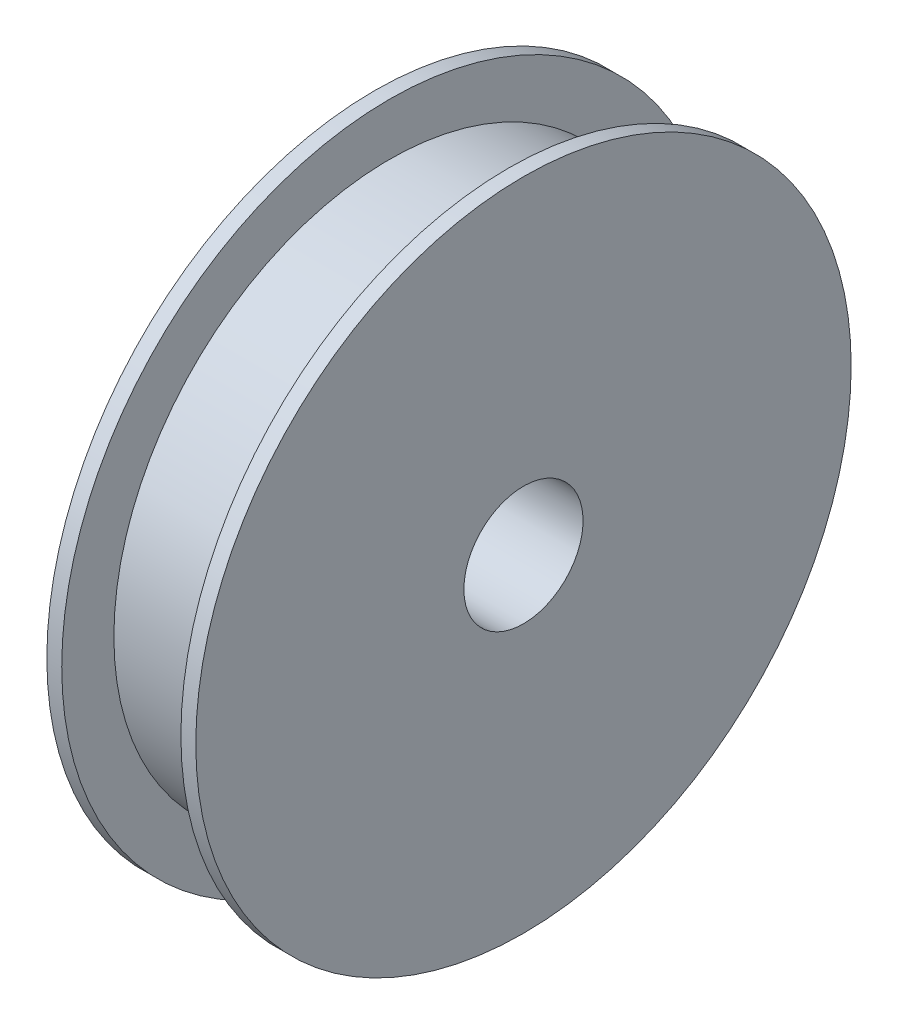
ISO-10303-21;
HEADER;
FILE_DESCRIPTION(('STEP AP214'),'2;1');
FILE_NAME('part.step','',(''),(''),'','','');
FILE_SCHEMA(('AUTOMOTIVE_DESIGN { 1 0 10303 214 1 1 1 1 }'));
ENDSEC;
DATA;
#1=APPLICATION_CONTEXT('core data for automotive mechanical design processes');
#2=APPLICATION_PROTOCOL_DEFINITION('international standard','automotive_design',2000,#1);
#3=PRODUCT_CONTEXT('',#1,'mechanical');
#4=PRODUCT('Part','Part','',(#3));
#5=PRODUCT_RELATED_PRODUCT_CATEGORY('part','',(#4));
#6=PRODUCT_DEFINITION_FORMATION('','',#4);
#7=PRODUCT_DEFINITION_CONTEXT('part definition',#1,'design');
#8=PRODUCT_DEFINITION('design','',#6,#7);
#9=PRODUCT_DEFINITION_SHAPE('','',#8);
#10=(LENGTH_UNIT() NAMED_UNIT(*) SI_UNIT(.MILLI.,.METRE.));
#11=(NAMED_UNIT(*) PLANE_ANGLE_UNIT() SI_UNIT($,.RADIAN.));
#12=(NAMED_UNIT(*) SI_UNIT($,.STERADIAN.) SOLID_ANGLE_UNIT());
#13=UNCERTAINTY_MEASURE_WITH_UNIT(LENGTH_MEASURE(1.E-05),#10,'distance_accuracy_value','');
#14=(GEOMETRIC_REPRESENTATION_CONTEXT(3) GLOBAL_UNCERTAINTY_ASSIGNED_CONTEXT((#13)) GLOBAL_UNIT_ASSIGNED_CONTEXT((#10,
#11,#12)) REPRESENTATION_CONTEXT('',''));
#15=CARTESIAN_POINT('',(0.,0.,0.));
#16=DIRECTION('',(0.,0.,1.));
#17=DIRECTION('',(1.,0.,0.));
#18=AXIS2_PLACEMENT_3D('',#15,#16,#17);
#19=CARTESIAN_POINT('',(50.2282166998161,18.5,0.));
#20=DIRECTION('',(-1.,0.,0.));
#21=DIRECTION('',(0.,0.,1.));
#22=AXIS2_PLACEMENT_3D('',#19,#20,#21);
#23=PLANE('',#22);
#24=CARTESIAN_POINT('',(50.2282166998161,0.,0.));
#25=DIRECTION('',(-1.,0.,0.));
#26=DIRECTION('',(0.,0.,1.));
#27=AXIS2_PLACEMENT_3D('',#24,#25,#26);
#28=CIRCLE('',#27,22.);
#29=CARTESIAN_POINT('',(50.2282166998161,0.,22.));
#30=VERTEX_POINT('',#29);
#31=EDGE_CURVE('E10',#30,#30,#28,.T.);
#32=ORIENTED_EDGE('',*,*,#31,.F.);
#33=EDGE_LOOP('',(#32));
#34=FACE_BOUND('',#33,.T.);
#35=CARTESIAN_POINT('',(50.2282166998161,0.,0.));
#36=DIRECTION('',(-1.,0.,0.));
#37=DIRECTION('',(0.,0.,1.));
#38=AXIS2_PLACEMENT_3D('',#35,#36,#37);
#39=CIRCLE('',#38,18.5);
#40=CARTESIAN_POINT('',(50.2282166998161,0.,18.5));
#41=VERTEX_POINT('',#40);
#42=EDGE_CURVE('E69',#41,#41,#39,.T.);
#43=ORIENTED_EDGE('',*,*,#42,.T.);
#44=EDGE_LOOP('',(#43));
#45=FACE_BOUND('',#44,.T.);
#46=ADVANCED_FACE('F35',(#34,#45),#23,.F.);
#47=CARTESIAN_POINT('',(-58.1666151501891,0.,0.));
#48=DIRECTION('',(-1.,0.,0.));
#49=DIRECTION('',(0.,0.,1.));
#50=AXIS2_PLACEMENT_3D('',#47,#48,#49);
#51=CYLINDRICAL_SURFACE('',#50,22.);
#52=CARTESIAN_POINT('',(49.2282166998161,0.,0.));
#53=DIRECTION('',(-1.,0.,0.));
#54=DIRECTION('',(0.,0.,1.));
#55=AXIS2_PLACEMENT_3D('',#52,#53,#54);
#56=CIRCLE('',#55,22.);
#57=CARTESIAN_POINT('',(49.2282166998161,0.,22.));
#58=VERTEX_POINT('',#57);
#59=EDGE_CURVE('E41',#58,#58,#56,.T.);
#60=ORIENTED_EDGE('',*,*,#59,.F.);
#61=EDGE_LOOP('',(#60));
#62=FACE_BOUND('',#61,.T.);
#63=ORIENTED_EDGE('',*,*,#31,.T.);
#64=EDGE_LOOP('',(#63));
#65=FACE_BOUND('',#64,.T.);
#66=ADVANCED_FACE('F118',(#62,#65),#51,.T.);
#67=CARTESIAN_POINT('',(49.2282166998161,10.,0.));
#68=DIRECTION('',(1.,0.,0.));
#69=DIRECTION('',(0.,0.,-1.));
#70=AXIS2_PLACEMENT_3D('',#67,#68,#69);
#71=PLANE('',#70);
#72=CARTESIAN_POINT('',(49.2282166998161,0.,0.));
#73=DIRECTION('',(-1.,0.,0.));
#74=DIRECTION('',(0.,0.,1.));
#75=AXIS2_PLACEMENT_3D('',#72,#73,#74);
#76=CIRCLE('',#75,10.);
#77=CARTESIAN_POINT('',(49.2282166998161,0.,10.));
#78=VERTEX_POINT('',#77);
#79=EDGE_CURVE('E45',#78,#78,#76,.T.);
#80=ORIENTED_EDGE('',*,*,#79,.F.);
#81=EDGE_LOOP('',(#80));
#82=FACE_BOUND('',#81,.T.);
#83=ORIENTED_EDGE('',*,*,#59,.T.);
#84=EDGE_LOOP('',(#83));
#85=FACE_BOUND('',#84,.T.);
#86=ADVANCED_FACE('F113',(#82,#85),#71,.F.);
#87=CARTESIAN_POINT('',(-58.1666151501891,0.,0.));
#88=DIRECTION('',(-1.,0.,0.));
#89=DIRECTION('',(0.,0.,1.));
#90=AXIS2_PLACEMENT_3D('',#87,#88,#89);
#91=CYLINDRICAL_SURFACE('',#90,10.);
#92=CARTESIAN_POINT('',(42.228216699816,0.,0.));
#93=DIRECTION('',(-1.,0.,0.));
#94=DIRECTION('',(0.,0.,1.));
#95=AXIS2_PLACEMENT_3D('',#92,#93,#94);
#96=CIRCLE('',#95,10.);
#97=CARTESIAN_POINT('',(42.228216699816,0.,10.));
#98=VERTEX_POINT('',#97);
#99=EDGE_CURVE('E49',#98,#98,#96,.T.);
#100=ORIENTED_EDGE('',*,*,#99,.F.);
#101=EDGE_LOOP('',(#100));
#102=FACE_BOUND('',#101,.T.);
#103=ORIENTED_EDGE('',*,*,#79,.T.);
#104=EDGE_LOOP('',(#103));
#105=FACE_BOUND('',#104,.T.);
#106=ADVANCED_FACE('F107',(#102,#105),#91,.T.);
#107=CARTESIAN_POINT('',(42.2282166998161,10.,0.));
#108=DIRECTION('',(1.,0.,0.));
#109=DIRECTION('',(0.,0.,-1.));
#110=AXIS2_PLACEMENT_3D('',#107,#108,#109);
#111=PLANE('',#110);
#112=CARTESIAN_POINT('',(42.228216699816,0.,0.));
#113=DIRECTION('',(-1.,0.,0.));
#114=DIRECTION('',(0.,0.,1.));
#115=AXIS2_PLACEMENT_3D('',#112,#113,#114);
#116=CIRCLE('',#115,4.);
#117=CARTESIAN_POINT('',(42.228216699816,0.,4.));
#118=VERTEX_POINT('',#117);
#119=EDGE_CURVE('E54',#118,#118,#116,.T.);
#120=ORIENTED_EDGE('',*,*,#119,.F.);
#121=EDGE_LOOP('',(#120));
#122=FACE_BOUND('',#121,.T.);
#123=ORIENTED_EDGE('',*,*,#99,.T.);
#124=EDGE_LOOP('',(#123));
#125=FACE_BOUND('',#124,.T.);
#126=ADVANCED_FACE('F101',(#122,#125),#111,.F.);
#127=CARTESIAN_POINT('',(-58.1666151501891,0.,0.));
#128=DIRECTION('',(-1.,0.,0.));
#129=DIRECTION('',(0.,0.,1.));
#130=AXIS2_PLACEMENT_3D('',#127,#128,#129);
#131=CYLINDRICAL_SURFACE('',#130,4.);
#132=CARTESIAN_POINT('',(59.2282166998161,0.,0.));
#133=DIRECTION('',(-1.,0.,0.));
#134=DIRECTION('',(0.,0.,1.));
#135=AXIS2_PLACEMENT_3D('',#132,#133,#134);
#136=CIRCLE('',#135,4.);
#137=CARTESIAN_POINT('',(59.2282166998161,0.,4.));
#138=VERTEX_POINT('',#137);
#139=EDGE_CURVE('E57',#138,#138,#136,.T.);
#140=ORIENTED_EDGE('',*,*,#139,.F.);
#141=EDGE_LOOP('',(#140));
#142=FACE_BOUND('',#141,.T.);
#143=ORIENTED_EDGE('',*,*,#119,.T.);
#144=EDGE_LOOP('',(#143));
#145=FACE_BOUND('',#144,.T.);
#146=ADVANCED_FACE('F95',(#142,#145),#131,.F.);
#147=CARTESIAN_POINT('',(59.2282166998161,22.,0.));
#148=DIRECTION('',(-1.,0.,0.));
#149=DIRECTION('',(0.,0.,1.));
#150=AXIS2_PLACEMENT_3D('',#147,#148,#149);
#151=PLANE('',#150);
#152=CARTESIAN_POINT('',(59.2282166998161,0.,0.));
#153=DIRECTION('',(-1.,0.,0.));
#154=DIRECTION('',(0.,0.,1.));
#155=AXIS2_PLACEMENT_3D('',#152,#153,#154);
#156=CIRCLE('',#155,22.);
#157=CARTESIAN_POINT('',(59.2282166998161,0.,22.));
#158=VERTEX_POINT('',#157);
#159=EDGE_CURVE('E60',#158,#158,#156,.T.);
#160=ORIENTED_EDGE('',*,*,#159,.F.);
#161=EDGE_LOOP('',(#160));
#162=FACE_BOUND('',#161,.T.);
#163=ORIENTED_EDGE('',*,*,#139,.T.);
#164=EDGE_LOOP('',(#163));
#165=FACE_BOUND('',#164,.T.);
#166=ADVANCED_FACE('F89',(#162,#165),#151,.F.);
#167=CARTESIAN_POINT('',(-58.1666151501891,0.,0.));
#168=DIRECTION('',(-1.,0.,0.));
#169=DIRECTION('',(0.,0.,1.));
#170=AXIS2_PLACEMENT_3D('',#167,#168,#169);
#171=CYLINDRICAL_SURFACE('',#170,22.);
#172=CARTESIAN_POINT('',(58.2282166998161,0.,0.));
#173=DIRECTION('',(-1.,0.,0.));
#174=DIRECTION('',(0.,0.,1.));
#175=AXIS2_PLACEMENT_3D('',#172,#173,#174);
#176=CIRCLE('',#175,22.);
#177=CARTESIAN_POINT('',(58.2282166998161,0.,22.));
#178=VERTEX_POINT('',#177);
#179=EDGE_CURVE('E63',#178,#178,#176,.T.);
#180=ORIENTED_EDGE('',*,*,#179,.F.);
#181=EDGE_LOOP('',(#180));
#182=FACE_BOUND('',#181,.T.);
#183=ORIENTED_EDGE('',*,*,#159,.T.);
#184=EDGE_LOOP('',(#183));
#185=FACE_BOUND('',#184,.T.);
#186=ADVANCED_FACE('F83',(#182,#185),#171,.T.);
#187=CARTESIAN_POINT('',(58.2282166998161,22.,0.));
#188=DIRECTION('',(1.,0.,0.));
#189=DIRECTION('',(0.,0.,-1.));
#190=AXIS2_PLACEMENT_3D('',#187,#188,#189);
#191=PLANE('',#190);
#192=CARTESIAN_POINT('',(58.2282166998161,0.,0.));
#193=DIRECTION('',(-1.,0.,0.));
#194=DIRECTION('',(0.,0.,1.));
#195=AXIS2_PLACEMENT_3D('',#192,#193,#194);
#196=CIRCLE('',#195,18.5);
#197=CARTESIAN_POINT('',(58.2282166998161,0.,18.5));
#198=VERTEX_POINT('',#197);
#199=EDGE_CURVE('E66',#198,#198,#196,.T.);
#200=ORIENTED_EDGE('',*,*,#199,.F.);
#201=EDGE_LOOP('',(#200));
#202=FACE_BOUND('',#201,.T.);
#203=ORIENTED_EDGE('',*,*,#179,.T.);
#204=EDGE_LOOP('',(#203));
#205=FACE_BOUND('',#204,.T.);
#206=ADVANCED_FACE('F77',(#202,#205),#191,.F.);
#207=CARTESIAN_POINT('',(-58.1666151501891,0.,0.));
#208=DIRECTION('',(-1.,0.,0.));
#209=DIRECTION('',(0.,0.,1.));
#210=AXIS2_PLACEMENT_3D('',#207,#208,#209);
#211=CYLINDRICAL_SURFACE('',#210,18.5);
#212=ORIENTED_EDGE('',*,*,#42,.F.);
#213=EDGE_LOOP('',(#212));
#214=FACE_BOUND('',#213,.T.);
#215=ORIENTED_EDGE('',*,*,#199,.T.);
#216=EDGE_LOOP('',(#215));
#217=FACE_BOUND('',#216,.T.);
#218=ADVANCED_FACE('F74',(#214,#217),#211,.T.);
#219=CLOSED_SHELL('',(#46,#66,#86,#106,#126,#146,#166,#186,#206,#218));
#220=MANIFOLD_SOLID_BREP('B2',#219);
#221=ADVANCED_BREP_SHAPE_REPRESENTATION('',(#18,#220),#14);
#222=SHAPE_DEFINITION_REPRESENTATION(#9,#221);
ENDSEC;
END-ISO-10303-21;
